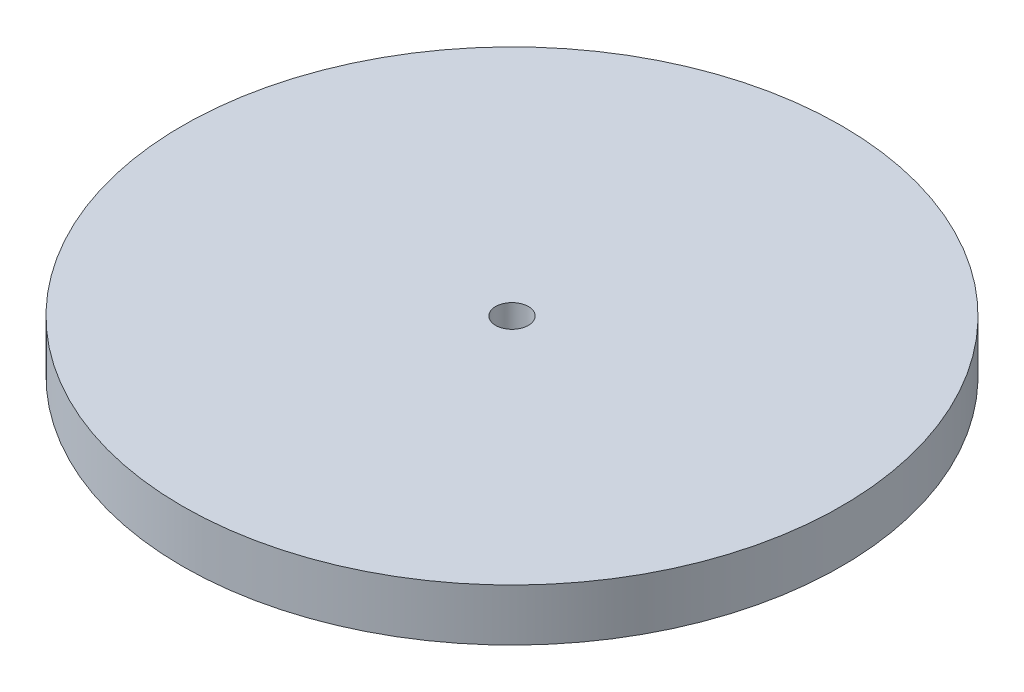
ISO-10303-21;
HEADER;
FILE_DESCRIPTION(('STEP AP214'),'2;1');
FILE_NAME('part.step','',(''),(''),'','','');
FILE_SCHEMA(('AUTOMOTIVE_DESIGN { 1 0 10303 214 1 1 1 1 }'));
ENDSEC;
DATA;
#1=APPLICATION_CONTEXT('core data for automotive mechanical design processes');
#2=APPLICATION_PROTOCOL_DEFINITION('international standard','automotive_design',2000,#1);
#3=PRODUCT_CONTEXT('',#1,'mechanical');
#4=PRODUCT('Part','Part','',(#3));
#5=PRODUCT_RELATED_PRODUCT_CATEGORY('part','',(#4));
#6=PRODUCT_DEFINITION_FORMATION('','',#4);
#7=PRODUCT_DEFINITION_CONTEXT('part definition',#1,'design');
#8=PRODUCT_DEFINITION('design','',#6,#7);
#9=PRODUCT_DEFINITION_SHAPE('','',#8);
#10=(LENGTH_UNIT() NAMED_UNIT(*) SI_UNIT(.MILLI.,.METRE.));
#11=(NAMED_UNIT(*) PLANE_ANGLE_UNIT() SI_UNIT($,.RADIAN.));
#12=(NAMED_UNIT(*) SI_UNIT($,.STERADIAN.) SOLID_ANGLE_UNIT());
#13=UNCERTAINTY_MEASURE_WITH_UNIT(LENGTH_MEASURE(1.E-05),#10,'distance_accuracy_value','');
#14=(GEOMETRIC_REPRESENTATION_CONTEXT(3) GLOBAL_UNCERTAINTY_ASSIGNED_CONTEXT((#13)) GLOBAL_UNIT_ASSIGNED_CONTEXT((#10,
#11,#12)) REPRESENTATION_CONTEXT('',''));
#15=CARTESIAN_POINT('',(0.,0.,0.));
#16=DIRECTION('',(0.,0.,1.));
#17=DIRECTION('',(1.,0.,0.));
#18=AXIS2_PLACEMENT_3D('',#15,#16,#17);
#19=CARTESIAN_POINT('',(0.,9.525,0.));
#20=DIRECTION('',(0.,1.,0.));
#21=DIRECTION('',(0.,0.,1.));
#22=AXIS2_PLACEMENT_3D('',#19,#20,#21);
#23=PLANE('',#22);
#24=CARTESIAN_POINT('',(0.,9.525,0.));
#25=DIRECTION('',(0.,1.,0.));
#26=DIRECTION('',(0.,0.,1.));
#27=AXIS2_PLACEMENT_3D('',#24,#25,#26);
#28=CIRCLE('',#27,120.65);
#29=CARTESIAN_POINT('',(0.,9.525,-120.65));
#30=VERTEX_POINT('',#29);
#31=EDGE_CURVE('E10',#30,#30,#28,.T.);
#32=ORIENTED_EDGE('',*,*,#31,.T.);
#33=EDGE_LOOP('',(#32));
#34=FACE_BOUND('',#33,.T.);
#35=CARTESIAN_POINT('',(0.,9.525,0.));
#36=DIRECTION('',(0.,1.,0.));
#37=DIRECTION('',(0.,0.,1.));
#38=AXIS2_PLACEMENT_3D('',#35,#36,#37);
#39=CIRCLE('',#38,6.00000000000001);
#40=CARTESIAN_POINT('',(0.,9.525,-6.00000000000001));
#41=VERTEX_POINT('',#40);
#42=EDGE_CURVE('E49',#41,#41,#39,.T.);
#43=ORIENTED_EDGE('',*,*,#42,.F.);
#44=EDGE_LOOP('',(#43));
#45=FACE_BOUND('',#44,.T.);
#46=ADVANCED_FACE('F35',(#34,#45),#23,.T.);
#47=CARTESIAN_POINT('',(0.,-9.525,0.));
#48=DIRECTION('',(0.,1.,0.));
#49=DIRECTION('',(0.,0.,1.));
#50=AXIS2_PLACEMENT_3D('',#47,#48,#49);
#51=PLANE('',#50);
#52=CARTESIAN_POINT('',(0.,-9.525,0.));
#53=DIRECTION('',(0.,1.,0.));
#54=DIRECTION('',(0.,0.,1.));
#55=AXIS2_PLACEMENT_3D('',#52,#53,#54);
#56=CIRCLE('',#55,120.65);
#57=CARTESIAN_POINT('',(0.,-9.525,-120.65));
#58=VERTEX_POINT('',#57);
#59=EDGE_CURVE('E39',#58,#58,#56,.T.);
#60=ORIENTED_EDGE('',*,*,#59,.F.);
#61=EDGE_LOOP('',(#60));
#62=FACE_BOUND('',#61,.T.);
#63=CARTESIAN_POINT('',(0.,-9.525,0.));
#64=DIRECTION('',(0.,1.,0.));
#65=DIRECTION('',(0.,0.,1.));
#66=AXIS2_PLACEMENT_3D('',#63,#64,#65);
#67=CIRCLE('',#66,6.00000000000001);
#68=CARTESIAN_POINT('',(0.,-9.525,-6.00000000000001));
#69=VERTEX_POINT('',#68);
#70=EDGE_CURVE('E51',#69,#69,#67,.T.);
#71=ORIENTED_EDGE('',*,*,#70,.T.);
#72=EDGE_LOOP('',(#71));
#73=FACE_BOUND('',#72,.T.);
#74=ADVANCED_FACE('F62',(#62,#73),#51,.F.);
#75=CARTESIAN_POINT('',(0.,9.525,0.));
#76=DIRECTION('',(0.,-1.,0.));
#77=DIRECTION('',(0.,0.,-1.));
#78=AXIS2_PLACEMENT_3D('',#75,#76,#77);
#79=CYLINDRICAL_SURFACE('',#78,120.65);
#80=CARTESIAN_POINT('',(0.,9.525,-120.65));
#81=CARTESIAN_POINT('',(0.,9.3265625,-120.65));
#82=CARTESIAN_POINT('',(0.,9.128125,-120.65));
#83=CARTESIAN_POINT('',(0.,8.73125,-120.65));
#84=CARTESIAN_POINT('',(0.,8.5328125,-120.65));
#85=CARTESIAN_POINT('',(0.,8.1359375,-120.65));
#86=CARTESIAN_POINT('',(0.,7.9375,-120.65));
#87=CARTESIAN_POINT('',(0.,7.540625,-120.65));
#88=CARTESIAN_POINT('',(0.,7.3421875,-120.65));
#89=CARTESIAN_POINT('',(0.,6.9453125,-120.65));
#90=CARTESIAN_POINT('',(0.,6.746875,-120.65));
#91=CARTESIAN_POINT('',(0.,6.35,-120.65));
#92=CARTESIAN_POINT('',(0.,6.1515625,-120.65));
#93=CARTESIAN_POINT('',(0.,5.7546875,-120.65));
#94=CARTESIAN_POINT('',(0.,5.55625,-120.65));
#95=CARTESIAN_POINT('',(0.,5.159375,-120.65));
#96=CARTESIAN_POINT('',(0.,4.9609375,-120.65));
#97=CARTESIAN_POINT('',(0.,4.5640625,-120.65));
#98=CARTESIAN_POINT('',(0.,4.365625,-120.65));
#99=CARTESIAN_POINT('',(0.,3.96875,-120.65));
#100=CARTESIAN_POINT('',(0.,3.7703125,-120.65));
#101=CARTESIAN_POINT('',(0.,3.3734375,-120.65));
#102=CARTESIAN_POINT('',(0.,3.175,-120.65));
#103=CARTESIAN_POINT('',(0.,2.778125,-120.65));
#104=CARTESIAN_POINT('',(0.,2.5796875,-120.65));
#105=CARTESIAN_POINT('',(0.,2.1828125,-120.65));
#106=CARTESIAN_POINT('',(0.,1.984375,-120.65));
#107=CARTESIAN_POINT('',(0.,1.5875,-120.65));
#108=CARTESIAN_POINT('',(0.,1.3890625,-120.65));
#109=CARTESIAN_POINT('',(0.,0.992187500000001,-120.65));
#110=CARTESIAN_POINT('',(0.,0.793750000000001,-120.65));
#111=CARTESIAN_POINT('',(0.,0.396875,-120.65));
#112=CARTESIAN_POINT('',(0.,0.1984375,-120.65));
#113=CARTESIAN_POINT('',(0.,-0.1984375,-120.65));
#114=CARTESIAN_POINT('',(0.,-0.396875,-120.65));
#115=CARTESIAN_POINT('',(0.,-0.793750000000001,-120.65));
#116=CARTESIAN_POINT('',(0.,-0.992187500000001,-120.65));
#117=CARTESIAN_POINT('',(0.,-1.3890625,-120.65));
#118=CARTESIAN_POINT('',(0.,-1.5875,-120.65));
#119=CARTESIAN_POINT('',(0.,-1.984375,-120.65));
#120=CARTESIAN_POINT('',(0.,-2.1828125,-120.65));
#121=CARTESIAN_POINT('',(0.,-2.5796875,-120.65));
#122=CARTESIAN_POINT('',(0.,-2.778125,-120.65));
#123=CARTESIAN_POINT('',(0.,-3.175,-120.65));
#124=CARTESIAN_POINT('',(0.,-3.3734375,-120.65));
#125=CARTESIAN_POINT('',(0.,-3.7703125,-120.65));
#126=CARTESIAN_POINT('',(0.,-3.96875,-120.65));
#127=CARTESIAN_POINT('',(0.,-4.365625,-120.65));
#128=CARTESIAN_POINT('',(0.,-4.5640625,-120.65));
#129=CARTESIAN_POINT('',(0.,-4.9609375,-120.65));
#130=CARTESIAN_POINT('',(0.,-5.159375,-120.65));
#131=CARTESIAN_POINT('',(0.,-5.55625,-120.65));
#132=CARTESIAN_POINT('',(0.,-5.7546875,-120.65));
#133=CARTESIAN_POINT('',(0.,-6.1515625,-120.65));
#134=CARTESIAN_POINT('',(0.,-6.35,-120.65));
#135=CARTESIAN_POINT('',(0.,-6.746875,-120.65));
#136=CARTESIAN_POINT('',(0.,-6.9453125,-120.65));
#137=CARTESIAN_POINT('',(0.,-7.3421875,-120.65));
#138=CARTESIAN_POINT('',(0.,-7.540625,-120.65));
#139=CARTESIAN_POINT('',(0.,-7.9375,-120.65));
#140=CARTESIAN_POINT('',(0.,-8.1359375,-120.65));
#141=CARTESIAN_POINT('',(0.,-8.5328125,-120.65));
#142=CARTESIAN_POINT('',(0.,-8.73125,-120.65));
#143=CARTESIAN_POINT('',(0.,-9.128125,-120.65));
#144=CARTESIAN_POINT('',(0.,-9.3265625,-120.65));
#145=CARTESIAN_POINT('',(0.,-9.525,-120.65));
#146=B_SPLINE_CURVE_WITH_KNOTS('',3,(#80,#81,#82,#83,#84,#85,#86,#87,#88,#89,#90,#91,#92,#93,
#94,#95,#96,#97,#98,#99,#100,#101,#102,#103,#104,#105,#106,#107,#108,#109,#110,#111,#112,#113,
#114,#115,#116,#117,#118,#119,#120,#121,#122,#123,#124,#125,#126,#127,#128,#129,#130,#131,#132,
#133,#134,#135,#136,#137,#138,#139,#140,#141,#142,#143,#144,#145),.UNSPECIFIED.,.F.,.F.,(4,2,2,
2,2,2,2,2,2,2,2,2,2,2,2,2,2,2,2,2,2,2,2,2,2,2,2,2,2,2,2,2,4),(0.,0.5953125,1.190625,1.7859375,
2.38125,2.9765625,3.571875,4.1671875,4.7625,5.3578125,5.953125,6.5484375,7.14375,7.7390625,
8.334375,8.9296875,9.525,10.1203125,10.715625,11.3109375,11.90625,12.5015625,13.096875,
13.6921875,14.2875,14.8828125,15.478125,16.0734375,16.66875,17.2640625,17.859375,18.4546875,
19.05),.UNSPECIFIED.);
#147=EDGE_CURVE('BSEAM37',#30,#58,#146,.T.);
#148=ORIENTED_EDGE('',*,*,#31,.F.);
#149=ORIENTED_EDGE('',*,*,#59,.T.);
#150=ORIENTED_EDGE('',*,*,#147,.T.);
#151=ORIENTED_EDGE('',*,*,#147,.F.);
#152=EDGE_LOOP('',(#148,#150,#149,#151));
#153=FACE_BOUND('',#152,.T.);
#154=ADVANCED_FACE('F37',(#153),#79,.T.);
#155=CARTESIAN_POINT('',(0.,9.525,0.));
#156=DIRECTION('',(0.,-1.,0.));
#157=DIRECTION('',(0.,0.,-1.));
#158=AXIS2_PLACEMENT_3D('',#155,#156,#157);
#159=CYLINDRICAL_SURFACE('',#158,6.00000000000001);
#160=CARTESIAN_POINT('',(0.,9.525,-6.00000000000001));
#161=CARTESIAN_POINT('',(0.,9.3265625,-6.00000000000001));
#162=CARTESIAN_POINT('',(0.,9.128125,-6.00000000000001));
#163=CARTESIAN_POINT('',(0.,8.73125,-6.00000000000001));
#164=CARTESIAN_POINT('',(0.,8.5328125,-6.00000000000001));
#165=CARTESIAN_POINT('',(0.,8.1359375,-6.00000000000001));
#166=CARTESIAN_POINT('',(0.,7.9375,-6.00000000000001));
#167=CARTESIAN_POINT('',(0.,7.540625,-6.00000000000001));
#168=CARTESIAN_POINT('',(0.,7.3421875,-6.00000000000001));
#169=CARTESIAN_POINT('',(0.,6.9453125,-6.00000000000001));
#170=CARTESIAN_POINT('',(0.,6.746875,-6.00000000000001));
#171=CARTESIAN_POINT('',(0.,6.35,-6.00000000000001));
#172=CARTESIAN_POINT('',(0.,6.1515625,-6.00000000000001));
#173=CARTESIAN_POINT('',(0.,5.7546875,-6.00000000000001));
#174=CARTESIAN_POINT('',(0.,5.55625,-6.00000000000001));
#175=CARTESIAN_POINT('',(0.,5.159375,-6.00000000000001));
#176=CARTESIAN_POINT('',(0.,4.9609375,-6.00000000000001));
#177=CARTESIAN_POINT('',(0.,4.5640625,-6.00000000000001));
#178=CARTESIAN_POINT('',(0.,4.365625,-6.00000000000001));
#179=CARTESIAN_POINT('',(0.,3.96875,-6.00000000000001));
#180=CARTESIAN_POINT('',(0.,3.7703125,-6.00000000000001));
#181=CARTESIAN_POINT('',(0.,3.3734375,-6.00000000000001));
#182=CARTESIAN_POINT('',(0.,3.175,-6.00000000000001));
#183=CARTESIAN_POINT('',(0.,2.778125,-6.00000000000001));
#184=CARTESIAN_POINT('',(0.,2.5796875,-6.00000000000001));
#185=CARTESIAN_POINT('',(0.,2.1828125,-6.00000000000001));
#186=CARTESIAN_POINT('',(0.,1.984375,-6.00000000000001));
#187=CARTESIAN_POINT('',(0.,1.5875,-6.00000000000001));
#188=CARTESIAN_POINT('',(0.,1.3890625,-6.00000000000001));
#189=CARTESIAN_POINT('',(0.,0.992187499999999,-6.00000000000001));
#190=CARTESIAN_POINT('',(0.,0.793749999999999,-6.00000000000001));
#191=CARTESIAN_POINT('',(0.,0.396874999999998,-6.00000000000001));
#192=CARTESIAN_POINT('',(0.,0.198437499999998,-6.00000000000001));
#193=CARTESIAN_POINT('',(0.,-0.198437500000002,-6.00000000000001));
#194=CARTESIAN_POINT('',(0.,-0.396875000000002,-6.00000000000001));
#195=CARTESIAN_POINT('',(0.,-0.793750000000002,-6.00000000000001));
#196=CARTESIAN_POINT('',(0.,-0.992187500000002,-6.00000000000001));
#197=CARTESIAN_POINT('',(0.,-1.3890625,-6.00000000000001));
#198=CARTESIAN_POINT('',(0.,-1.5875,-6.00000000000001));
#199=CARTESIAN_POINT('',(0.,-1.984375,-6.00000000000001));
#200=CARTESIAN_POINT('',(0.,-2.1828125,-6.00000000000001));
#201=CARTESIAN_POINT('',(0.,-2.5796875,-6.00000000000001));
#202=CARTESIAN_POINT('',(0.,-2.778125,-6.00000000000001));
#203=CARTESIAN_POINT('',(0.,-3.175,-6.00000000000001));
#204=CARTESIAN_POINT('',(0.,-3.3734375,-6.00000000000001));
#205=CARTESIAN_POINT('',(0.,-3.7703125,-6.00000000000001));
#206=CARTESIAN_POINT('',(0.,-3.96875,-6.00000000000001));
#207=CARTESIAN_POINT('',(0.,-4.365625,-6.00000000000001));
#208=CARTESIAN_POINT('',(0.,-4.5640625,-6.00000000000001));
#209=CARTESIAN_POINT('',(0.,-4.9609375,-6.00000000000001));
#210=CARTESIAN_POINT('',(0.,-5.159375,-6.00000000000001));
#211=CARTESIAN_POINT('',(0.,-5.55625,-6.00000000000001));
#212=CARTESIAN_POINT('',(0.,-5.7546875,-6.00000000000001));
#213=CARTESIAN_POINT('',(0.,-6.1515625,-6.00000000000001));
#214=CARTESIAN_POINT('',(0.,-6.35,-6.00000000000001));
#215=CARTESIAN_POINT('',(0.,-6.746875,-6.00000000000001));
#216=CARTESIAN_POINT('',(0.,-6.9453125,-6.00000000000001));
#217=CARTESIAN_POINT('',(0.,-7.3421875,-6.00000000000001));
#218=CARTESIAN_POINT('',(0.,-7.540625,-6.00000000000001));
#219=CARTESIAN_POINT('',(0.,-7.9375,-6.00000000000001));
#220=CARTESIAN_POINT('',(0.,-8.1359375,-6.00000000000001));
#221=CARTESIAN_POINT('',(0.,-8.5328125,-6.00000000000001));
#222=CARTESIAN_POINT('',(0.,-8.73125,-6.00000000000001));
#223=CARTESIAN_POINT('',(0.,-9.128125,-6.00000000000001));
#224=CARTESIAN_POINT('',(0.,-9.3265625,-6.00000000000001));
#225=CARTESIAN_POINT('',(0.,-9.525,-6.00000000000001));
#226=B_SPLINE_CURVE_WITH_KNOTS('',3,(#160,#161,#162,#163,#164,#165,#166,#167,#168,#169,#170,
#171,#172,#173,#174,#175,#176,#177,#178,#179,#180,#181,#182,#183,#184,#185,#186,#187,#188,#189,
#190,#191,#192,#193,#194,#195,#196,#197,#198,#199,#200,#201,#202,#203,#204,#205,#206,#207,#208,
#209,#210,#211,#212,#213,#214,#215,#216,#217,#218,#219,#220,#221,#222,#223,#224,#225),
.UNSPECIFIED.,.F.,.F.,(4,2,2,2,2,2,2,2,2,2,2,2,2,2,2,2,2,2,2,2,2,2,2,2,2,2,2,2,2,2,2,2,4),(0.,
0.595312499999999,1.190625,1.7859375,2.38125,2.9765625,3.571875,4.1671875,4.7625,5.3578125,
5.953125,6.5484375,7.14375,7.7390625,8.334375,8.9296875,9.525,10.1203125,10.715625,11.3109375,
11.90625,12.5015625,13.096875,13.6921875,14.2875,14.8828125,15.478125,16.0734375,16.66875,
17.2640625,17.859375,18.4546875,19.05),.UNSPECIFIED.);
#227=EDGE_CURVE('BSEAM58',#41,#69,#226,.T.);
#228=ORIENTED_EDGE('',*,*,#42,.T.);
#229=ORIENTED_EDGE('',*,*,#70,.F.);
#230=ORIENTED_EDGE('',*,*,#227,.T.);
#231=ORIENTED_EDGE('',*,*,#227,.F.);
#232=EDGE_LOOP('',(#228,#230,#229,#231));
#233=FACE_BOUND('',#232,.T.);
#234=ADVANCED_FACE('F58',(#233),#159,.F.);
#235=CLOSED_SHELL('',(#46,#74,#154,#234));
#236=MANIFOLD_SOLID_BREP('B2',#235);
#237=ADVANCED_BREP_SHAPE_REPRESENTATION('',(#18,#236),#14);
#238=SHAPE_DEFINITION_REPRESENTATION(#9,#237);
ENDSEC;
END-ISO-10303-21;
